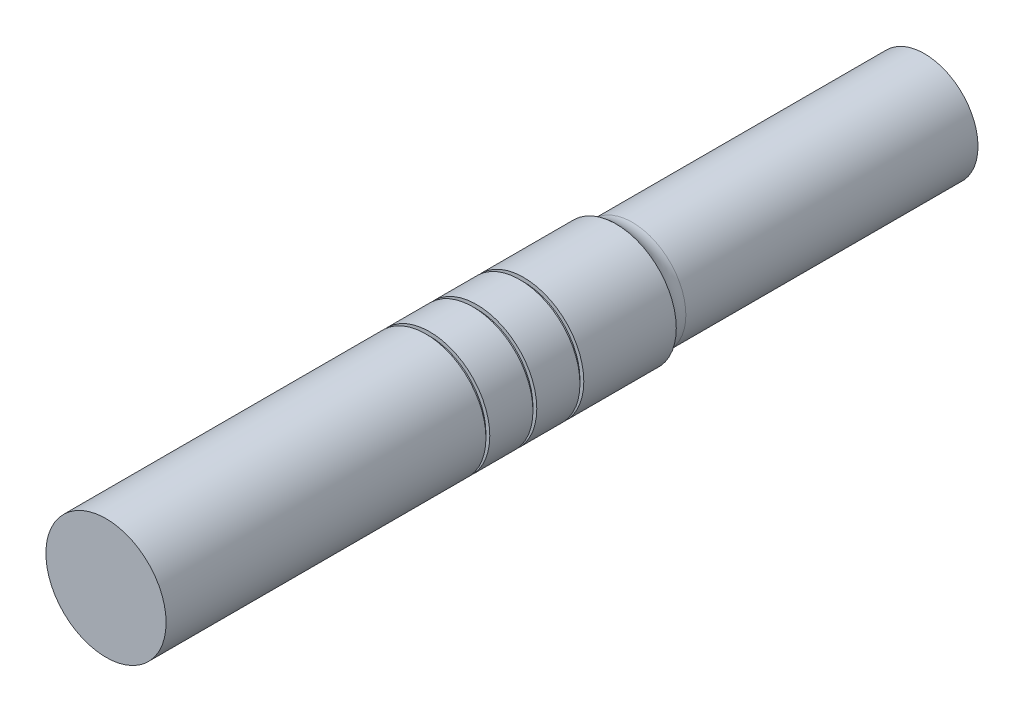
ISO-10303-21;
HEADER;
FILE_DESCRIPTION(('STEP AP214'),'2;1');
FILE_NAME('part.step','',(''),(''),'','','');
FILE_SCHEMA(('AUTOMOTIVE_DESIGN { 1 0 10303 214 1 1 1 1 }'));
ENDSEC;
DATA;
#1=APPLICATION_CONTEXT('core data for automotive mechanical design processes');
#2=APPLICATION_PROTOCOL_DEFINITION('international standard','automotive_design',2000,#1);
#3=PRODUCT_CONTEXT('',#1,'mechanical');
#4=PRODUCT('Part','Part','',(#3));
#5=PRODUCT_RELATED_PRODUCT_CATEGORY('part','',(#4));
#6=PRODUCT_DEFINITION_FORMATION('','',#4);
#7=PRODUCT_DEFINITION_CONTEXT('part definition',#1,'design');
#8=PRODUCT_DEFINITION('design','',#6,#7);
#9=PRODUCT_DEFINITION_SHAPE('','',#8);
#10=(LENGTH_UNIT() NAMED_UNIT(*) SI_UNIT(.MILLI.,.METRE.));
#11=(NAMED_UNIT(*) PLANE_ANGLE_UNIT() SI_UNIT($,.RADIAN.));
#12=(NAMED_UNIT(*) SI_UNIT($,.STERADIAN.) SOLID_ANGLE_UNIT());
#13=UNCERTAINTY_MEASURE_WITH_UNIT(LENGTH_MEASURE(1.E-05),#10,'distance_accuracy_value','');
#14=(GEOMETRIC_REPRESENTATION_CONTEXT(3) GLOBAL_UNCERTAINTY_ASSIGNED_CONTEXT((#13)) GLOBAL_UNIT_ASSIGNED_CONTEXT((#10,
#11,#12)) REPRESENTATION_CONTEXT('',''));
#15=CARTESIAN_POINT('',(0.,0.,0.));
#16=DIRECTION('',(0.,0.,1.));
#17=DIRECTION('',(1.,0.,0.));
#18=AXIS2_PLACEMENT_3D('',#15,#16,#17);
#19=CARTESIAN_POINT('',(0.,0.,127.));
#20=DIRECTION('',(0.,0.,1.));
#21=DIRECTION('',(1.,0.,0.));
#22=AXIS2_PLACEMENT_3D('',#19,#20,#21);
#23=CYLINDRICAL_SURFACE('',#22,1.8542);
#24=CARTESIAN_POINT('',(0.,0.,-0.152399999999997));
#25=DIRECTION('',(0.,0.,1.));
#26=DIRECTION('',(1.,0.,0.));
#27=AXIS2_PLACEMENT_3D('',#24,#25,#26);
#28=CIRCLE('',#27,1.8542);
#29=CARTESIAN_POINT('',(1.8542,0.,-0.152399999999997));
#30=VERTEX_POINT('',#29);
#31=EDGE_CURVE('E104',#30,#30,#28,.T.);
#32=ORIENTED_EDGE('',*,*,#31,.F.);
#33=EDGE_LOOP('',(#32));
#34=FACE_BOUND('',#33,.T.);
#35=CARTESIAN_POINT('',(0.,0.,-0.279400000000013));
#36=DIRECTION('',(0.,0.,1.));
#37=DIRECTION('',(1.,0.,0.));
#38=AXIS2_PLACEMENT_3D('',#35,#36,#37);
#39=CIRCLE('',#38,1.8542);
#40=CARTESIAN_POINT('',(1.8542,0.,-0.279400000000013));
#41=VERTEX_POINT('',#40);
#42=EDGE_CURVE('E60',#41,#41,#39,.T.);
#43=ORIENTED_EDGE('',*,*,#42,.T.);
#44=EDGE_LOOP('',(#43));
#45=FACE_BOUND('',#44,.T.);
#46=ADVANCED_FACE('F39',(#34,#45),#23,.T.);
#47=CARTESIAN_POINT('',(0.,1.9812,-0.15240000000001));
#48=DIRECTION('',(0.,0.,1.));
#49=DIRECTION('',(1.,0.,0.));
#50=AXIS2_PLACEMENT_3D('',#47,#48,#49);
#51=PLANE('',#50);
#52=CARTESIAN_POINT('',(0.,0.,-0.152399999999997));
#53=DIRECTION('',(0.,0.,1.));
#54=DIRECTION('',(1.,0.,0.));
#55=AXIS2_PLACEMENT_3D('',#52,#53,#54);
#56=CIRCLE('',#55,1.9812);
#57=CARTESIAN_POINT('',(1.9812,0.,-0.152399999999997));
#58=VERTEX_POINT('',#57);
#59=EDGE_CURVE('E101',#58,#58,#56,.T.);
#60=ORIENTED_EDGE('',*,*,#59,.F.);
#61=EDGE_LOOP('',(#60));
#62=FACE_BOUND('',#61,.T.);
#63=ORIENTED_EDGE('',*,*,#31,.T.);
#64=EDGE_LOOP('',(#63));
#65=FACE_BOUND('',#64,.T.);
#66=ADVANCED_FACE('F131',(#62,#65),#51,.F.);
#67=CARTESIAN_POINT('',(0.,0.,127.));
#68=DIRECTION('',(0.,0.,1.));
#69=DIRECTION('',(1.,0.,0.));
#70=AXIS2_PLACEMENT_3D('',#67,#68,#69);
#71=CYLINDRICAL_SURFACE('',#70,1.9812);
#72=CARTESIAN_POINT('',(0.,0.,1.26999999999999));
#73=DIRECTION('',(0.,0.,1.));
#74=DIRECTION('',(1.,0.,0.));
#75=AXIS2_PLACEMENT_3D('',#72,#73,#74);
#76=CIRCLE('',#75,1.9812);
#77=CARTESIAN_POINT('',(1.9812,0.,1.26999999999999));
#78=VERTEX_POINT('',#77);
#79=EDGE_CURVE('E98',#78,#78,#76,.T.);
#80=ORIENTED_EDGE('',*,*,#79,.F.);
#81=EDGE_LOOP('',(#80));
#82=FACE_BOUND('',#81,.T.);
#83=ORIENTED_EDGE('',*,*,#59,.T.);
#84=EDGE_LOOP('',(#83));
#85=FACE_BOUND('',#84,.T.);
#86=ADVANCED_FACE('F137',(#82,#85),#71,.T.);
#87=CARTESIAN_POINT('',(0.,1.9812,1.26999999999999));
#88=DIRECTION('',(0.,0.,-1.));
#89=DIRECTION('',(-1.,0.,0.));
#90=AXIS2_PLACEMENT_3D('',#87,#88,#89);
#91=PLANE('',#90);
#92=CARTESIAN_POINT('',(0.,0.,1.26999999999999));
#93=DIRECTION('',(0.,0.,1.));
#94=DIRECTION('',(1.,0.,0.));
#95=AXIS2_PLACEMENT_3D('',#92,#93,#94);
#96=CIRCLE('',#95,1.8542);
#97=CARTESIAN_POINT('',(1.8542,0.,1.26999999999999));
#98=VERTEX_POINT('',#97);
#99=EDGE_CURVE('E95',#98,#98,#96,.T.);
#100=ORIENTED_EDGE('',*,*,#99,.F.);
#101=EDGE_LOOP('',(#100));
#102=FACE_BOUND('',#101,.T.);
#103=ORIENTED_EDGE('',*,*,#79,.T.);
#104=EDGE_LOOP('',(#103));
#105=FACE_BOUND('',#104,.T.);
#106=ADVANCED_FACE('F145',(#102,#105),#91,.F.);
#107=CARTESIAN_POINT('',(0.,0.,127.));
#108=DIRECTION('',(0.,0.,1.));
#109=DIRECTION('',(1.,0.,0.));
#110=AXIS2_PLACEMENT_3D('',#107,#108,#109);
#111=CYLINDRICAL_SURFACE('',#110,1.8542);
#112=CARTESIAN_POINT('',(0.,0.,1.39699999999998));
#113=DIRECTION('',(0.,0.,1.));
#114=DIRECTION('',(1.,0.,0.));
#115=AXIS2_PLACEMENT_3D('',#112,#113,#114);
#116=CIRCLE('',#115,1.8542);
#117=CARTESIAN_POINT('',(1.8542,0.,1.39699999999998));
#118=VERTEX_POINT('',#117);
#119=EDGE_CURVE('E92',#118,#118,#116,.T.);
#120=ORIENTED_EDGE('',*,*,#119,.F.);
#121=EDGE_LOOP('',(#120));
#122=FACE_BOUND('',#121,.T.);
#123=ORIENTED_EDGE('',*,*,#99,.T.);
#124=EDGE_LOOP('',(#123));
#125=FACE_BOUND('',#124,.T.);
#126=ADVANCED_FACE('F149',(#122,#125),#111,.T.);
#127=CARTESIAN_POINT('',(0.,1.8542,1.39699999999999));
#128=DIRECTION('',(0.,0.,1.));
#129=DIRECTION('',(1.,0.,0.));
#130=AXIS2_PLACEMENT_3D('',#127,#128,#129);
#131=PLANE('',#130);
#132=CARTESIAN_POINT('',(0.,0.,1.39699999999998));
#133=DIRECTION('',(0.,0.,1.));
#134=DIRECTION('',(1.,0.,0.));
#135=AXIS2_PLACEMENT_3D('',#132,#133,#134);
#136=CIRCLE('',#135,1.9812);
#137=CARTESIAN_POINT('',(1.9812,0.,1.39699999999998));
#138=VERTEX_POINT('',#137);
#139=EDGE_CURVE('E89',#138,#138,#136,.T.);
#140=ORIENTED_EDGE('',*,*,#139,.F.);
#141=EDGE_LOOP('',(#140));
#142=FACE_BOUND('',#141,.T.);
#143=ORIENTED_EDGE('',*,*,#119,.T.);
#144=EDGE_LOOP('',(#143));
#145=FACE_BOUND('',#144,.T.);
#146=ADVANCED_FACE('F153',(#142,#145),#131,.F.);
#147=CARTESIAN_POINT('',(0.,0.,127.));
#148=DIRECTION('',(0.,0.,1.));
#149=DIRECTION('',(1.,0.,0.));
#150=AXIS2_PLACEMENT_3D('',#147,#148,#149);
#151=CYLINDRICAL_SURFACE('',#150,1.9812);
#152=CARTESIAN_POINT('',(0.,0.,2.81939999999999));
#153=DIRECTION('',(0.,0.,1.));
#154=DIRECTION('',(1.,0.,0.));
#155=AXIS2_PLACEMENT_3D('',#152,#153,#154);
#156=CIRCLE('',#155,1.9812);
#157=CARTESIAN_POINT('',(1.9812,0.,2.81939999999999));
#158=VERTEX_POINT('',#157);
#159=EDGE_CURVE('E86',#158,#158,#156,.T.);
#160=ORIENTED_EDGE('',*,*,#159,.F.);
#161=EDGE_LOOP('',(#160));
#162=FACE_BOUND('',#161,.T.);
#163=ORIENTED_EDGE('',*,*,#139,.T.);
#164=EDGE_LOOP('',(#163));
#165=FACE_BOUND('',#164,.T.);
#166=ADVANCED_FACE('F157',(#162,#165),#151,.T.);
#167=CARTESIAN_POINT('',(0.,1.9812,2.81939999999999));
#168=DIRECTION('',(0.,0.,-1.));
#169=DIRECTION('',(-1.,0.,0.));
#170=AXIS2_PLACEMENT_3D('',#167,#168,#169);
#171=PLANE('',#170);
#172=CARTESIAN_POINT('',(0.,0.,2.81939999999999));
#173=DIRECTION('',(0.,0.,1.));
#174=DIRECTION('',(1.,0.,0.));
#175=AXIS2_PLACEMENT_3D('',#172,#173,#174);
#176=CIRCLE('',#175,1.8542);
#177=CARTESIAN_POINT('',(1.8542,0.,2.81939999999999));
#178=VERTEX_POINT('',#177);
#179=EDGE_CURVE('E83',#178,#178,#176,.T.);
#180=ORIENTED_EDGE('',*,*,#179,.F.);
#181=EDGE_LOOP('',(#180));
#182=FACE_BOUND('',#181,.T.);
#183=ORIENTED_EDGE('',*,*,#159,.T.);
#184=EDGE_LOOP('',(#183));
#185=FACE_BOUND('',#184,.T.);
#186=ADVANCED_FACE('F161',(#182,#185),#171,.F.);
#187=CARTESIAN_POINT('',(0.,0.,127.));
#188=DIRECTION('',(0.,0.,1.));
#189=DIRECTION('',(1.,0.,0.));
#190=AXIS2_PLACEMENT_3D('',#187,#188,#189);
#191=CYLINDRICAL_SURFACE('',#190,1.8542);
#192=CARTESIAN_POINT('',(0.,0.,2.94639999999999));
#193=DIRECTION('',(0.,0.,1.));
#194=DIRECTION('',(1.,0.,0.));
#195=AXIS2_PLACEMENT_3D('',#192,#193,#194);
#196=CIRCLE('',#195,1.8542);
#197=CARTESIAN_POINT('',(1.8542,0.,2.94639999999999));
#198=VERTEX_POINT('',#197);
#199=EDGE_CURVE('E80',#198,#198,#196,.T.);
#200=ORIENTED_EDGE('',*,*,#199,.F.);
#201=EDGE_LOOP('',(#200));
#202=FACE_BOUND('',#201,.T.);
#203=ORIENTED_EDGE('',*,*,#179,.T.);
#204=EDGE_LOOP('',(#203));
#205=FACE_BOUND('',#204,.T.);
#206=ADVANCED_FACE('F165',(#202,#205),#191,.T.);
#207=CARTESIAN_POINT('',(0.,1.8542,2.94639999999999));
#208=DIRECTION('',(0.,0.,1.));
#209=DIRECTION('',(1.,0.,0.));
#210=AXIS2_PLACEMENT_3D('',#207,#208,#209);
#211=PLANE('',#210);
#212=CARTESIAN_POINT('',(0.,0.,2.94639999999999));
#213=DIRECTION('',(0.,0.,1.));
#214=DIRECTION('',(1.,0.,0.));
#215=AXIS2_PLACEMENT_3D('',#212,#213,#214);
#216=CIRCLE('',#215,1.9812);
#217=CARTESIAN_POINT('',(1.9812,0.,2.94639999999999));
#218=VERTEX_POINT('',#217);
#219=EDGE_CURVE('E77',#218,#218,#216,.T.);
#220=ORIENTED_EDGE('',*,*,#219,.F.);
#221=EDGE_LOOP('',(#220));
#222=FACE_BOUND('',#221,.T.);
#223=ORIENTED_EDGE('',*,*,#199,.T.);
#224=EDGE_LOOP('',(#223));
#225=FACE_BOUND('',#224,.T.);
#226=ADVANCED_FACE('F169',(#222,#225),#211,.F.);
#227=CARTESIAN_POINT('',(0.,0.,127.));
#228=DIRECTION('',(0.,0.,1.));
#229=DIRECTION('',(1.,0.,0.));
#230=AXIS2_PLACEMENT_3D('',#227,#228,#229);
#231=CYLINDRICAL_SURFACE('',#230,1.9812);
#232=CARTESIAN_POINT('',(0.,0.,13.4874));
#233=DIRECTION('',(0.,0.,1.));
#234=DIRECTION('',(1.,0.,0.));
#235=AXIS2_PLACEMENT_3D('',#232,#233,#234);
#236=CIRCLE('',#235,1.9812);
#237=CARTESIAN_POINT('',(1.9812,0.,13.4874));
#238=VERTEX_POINT('',#237);
#239=EDGE_CURVE('E74',#238,#238,#236,.T.);
#240=ORIENTED_EDGE('',*,*,#239,.F.);
#241=EDGE_LOOP('',(#240));
#242=FACE_BOUND('',#241,.T.);
#243=ORIENTED_EDGE('',*,*,#219,.T.);
#244=EDGE_LOOP('',(#243));
#245=FACE_BOUND('',#244,.T.);
#246=ADVANCED_FACE('F173',(#242,#245),#231,.T.);
#247=CARTESIAN_POINT('',(0.,0.,13.4874));
#248=DIRECTION('',(0.,0.,-1.));
#249=DIRECTION('',(-1.,0.,0.));
#250=AXIS2_PLACEMENT_3D('',#247,#248,#249);
#251=PLANE('',#250);
#252=ORIENTED_EDGE('',*,*,#239,.T.);
#253=EDGE_LOOP('',(#252));
#254=FACE_BOUND('',#253,.T.);
#255=ADVANCED_FACE('F127',(#254),#251,.F.);
#256=CARTESIAN_POINT('',(0.,0.,127.));
#257=DIRECTION('',(0.,0.,1.));
#258=DIRECTION('',(1.,0.,0.));
#259=AXIS2_PLACEMENT_3D('',#256,#257,#258);
#260=CYLINDRICAL_SURFACE('',#259,1.7653);
#261=CARTESIAN_POINT('',(0.,0.,-3.85883088920386));
#262=DIRECTION('',(0.,0.,1.));
#263=DIRECTION('',(1.,0.,0.));
#264=AXIS2_PLACEMENT_3D('',#261,#262,#263);
#265=CIRCLE('',#264,1.7653);
#266=CARTESIAN_POINT('',(1.7653,0.,-3.85883088920386));
#267=VERTEX_POINT('',#266);
#268=EDGE_CURVE('E47',#267,#267,#265,.F.);
#269=ORIENTED_EDGE('',*,*,#268,.T.);
#270=EDGE_LOOP('',(#269));
#271=FACE_BOUND('',#270,.T.);
#272=CARTESIAN_POINT('',(0.,0.,-13.4874));
#273=DIRECTION('',(0.,0.,1.));
#274=DIRECTION('',(1.,0.,0.));
#275=AXIS2_PLACEMENT_3D('',#272,#273,#274);
#276=CIRCLE('',#275,1.7653);
#277=CARTESIAN_POINT('',(1.7653,0.,-13.4874));
#278=VERTEX_POINT('',#277);
#279=EDGE_CURVE('E71',#278,#278,#276,.T.);
#280=ORIENTED_EDGE('',*,*,#279,.T.);
#281=EDGE_LOOP('',(#280));
#282=FACE_BOUND('',#281,.T.);
#283=ADVANCED_FACE('F109',(#271,#282),#260,.T.);
#284=CARTESIAN_POINT('',(0.,0.,127.));
#285=DIRECTION('',(0.,0.,1.));
#286=DIRECTION('',(1.,0.,0.));
#287=AXIS2_PLACEMENT_3D('',#284,#285,#286);
#288=CYLINDRICAL_SURFACE('',#287,1.9812);
#289=CARTESIAN_POINT('',(0.,0.,-0.279400000000013));
#290=DIRECTION('',(0.,0.,1.));
#291=DIRECTION('',(1.,0.,0.));
#292=AXIS2_PLACEMENT_3D('',#289,#290,#291);
#293=CIRCLE('',#292,1.9812);
#294=CARTESIAN_POINT('',(1.9812,0.,-0.279400000000013));
#295=VERTEX_POINT('',#294);
#296=EDGE_CURVE('E63',#295,#295,#293,.T.);
#297=ORIENTED_EDGE('',*,*,#296,.F.);
#298=EDGE_LOOP('',(#297));
#299=FACE_BOUND('',#298,.T.);
#300=CARTESIAN_POINT('',(0.,0.,-3.32740000000001));
#301=DIRECTION('',(0.,0.,1.));
#302=DIRECTION('',(1.,0.,0.));
#303=AXIS2_PLACEMENT_3D('',#300,#301,#302);
#304=CIRCLE('',#303,1.9812);
#305=CARTESIAN_POINT('',(1.9812,0.,-3.32740000000001));
#306=VERTEX_POINT('',#305);
#307=EDGE_CURVE('E68',#306,#306,#304,.T.);
#308=ORIENTED_EDGE('',*,*,#307,.T.);
#309=EDGE_LOOP('',(#308));
#310=FACE_BOUND('',#309,.T.);
#311=ADVANCED_FACE('F117',(#299,#310),#288,.T.);
#312=CARTESIAN_POINT('',(0.,1.8542,-0.27940000000001));
#313=DIRECTION('',(0.,0.,-1.));
#314=DIRECTION('',(-1.,0.,0.));
#315=AXIS2_PLACEMENT_3D('',#312,#313,#314);
#316=PLANE('',#315);
#317=ORIENTED_EDGE('',*,*,#42,.F.);
#318=EDGE_LOOP('',(#317));
#319=FACE_BOUND('',#318,.T.);
#320=ORIENTED_EDGE('',*,*,#296,.T.);
#321=EDGE_LOOP('',(#320));
#322=FACE_BOUND('',#321,.T.);
#323=ADVANCED_FACE('F114',(#319,#322),#316,.F.);
#324=CARTESIAN_POINT('',(0.,0.,-3.85883088920386));
#325=DIRECTION('',(0.,0.,1.));
#326=DIRECTION('',(1.,0.,0.));
#327=AXIS2_PLACEMENT_3D('',#324,#325,#326);
#328=TOROIDAL_SURFACE('',#327,2.5273,0.762);
#329=ORIENTED_EDGE('',*,*,#268,.F.);
#330=EDGE_LOOP('',(#329));
#331=FACE_BOUND('',#330,.T.);
#332=ORIENTED_EDGE('',*,*,#307,.F.);
#333=EDGE_LOOP('',(#332));
#334=FACE_BOUND('',#333,.T.);
#335=ADVANCED_FACE('F54',(#331,#334),#328,.F.);
#336=CARTESIAN_POINT('',(0.,0.,-12.6238));
#337=DIRECTION('',(0.,0.,-1.));
#338=DIRECTION('',(-1.,0.,0.));
#339=AXIS2_PLACEMENT_3D('',#336,#337,#338);
#340=CONICAL_SURFACE('',#339,1.1811,1.02974425867665);
#341=CARTESIAN_POINT('',(0.,0.,-11.9141235228666));
#342=VERTEX_POINT('',#341);
#343=VERTEX_LOOP('',#342);
#344=FACE_BOUND('',#343,.T.);
#345=CARTESIAN_POINT('',(0.,0.,-12.6238));
#346=DIRECTION('',(0.,0.,-1.));
#347=DIRECTION('',(-1.,0.,0.));
#348=AXIS2_PLACEMENT_3D('',#345,#346,#347);
#349=CIRCLE('',#348,1.1811);
#350=CARTESIAN_POINT('',(-1.1811,0.,-12.6238));
#351=VERTEX_POINT('',#350);
#352=EDGE_CURVE('E58',#351,#351,#349,.T.);
#353=ORIENTED_EDGE('',*,*,#352,.T.);
#354=EDGE_LOOP('',(#353));
#355=FACE_BOUND('',#354,.T.);
#356=ADVANCED_FACE('F50',(#344,#355),#340,.F.);
#357=CARTESIAN_POINT('',(0.,0.,-13.4874));
#358=DIRECTION('',(0.,0.,-1.));
#359=DIRECTION('',(-1.,0.,0.));
#360=AXIS2_PLACEMENT_3D('',#357,#358,#359);
#361=CYLINDRICAL_SURFACE('',#360,1.1811);
#362=CARTESIAN_POINT('',(0.,0.,-13.1501119727394));
#363=DIRECTION('',(0.,0.,1.));
#364=DIRECTION('',(1.,0.,0.));
#365=AXIS2_PLACEMENT_3D('',#362,#363,#364);
#366=CIRCLE('',#365,1.1811);
#367=CARTESIAN_POINT('',(1.1811,0.,-13.1501119727394));
#368=VERTEX_POINT('',#367);
#369=EDGE_CURVE('E11',#368,#368,#366,.F.);
#370=ORIENTED_EDGE('',*,*,#369,.T.);
#371=EDGE_LOOP('',(#370));
#372=FACE_BOUND('',#371,.T.);
#373=ORIENTED_EDGE('',*,*,#352,.F.);
#374=EDGE_LOOP('',(#373));
#375=FACE_BOUND('',#374,.T.);
#376=ADVANCED_FACE('F53',(#372,#375),#361,.F.);
#377=CARTESIAN_POINT('',(0.,0.,-13.1501119727394));
#378=DIRECTION('',(0.,0.,-1.));
#379=DIRECTION('',(-1.,0.,0.));
#380=AXIS2_PLACEMENT_3D('',#377,#378,#379);
#381=CONICAL_SURFACE('',#380,1.1811,1.0471975511966);
#382=ORIENTED_EDGE('',*,*,#279,.F.);
#383=EDGE_LOOP('',(#382));
#384=FACE_BOUND('',#383,.T.);
#385=ORIENTED_EDGE('',*,*,#369,.F.);
#386=EDGE_LOOP('',(#385));
#387=FACE_BOUND('',#386,.T.);
#388=ADVANCED_FACE('F42',(#384,#387),#381,.F.);
#389=CLOSED_SHELL('',(#46,#66,#86,#106,#126,#146,#166,#186,#206,#226,#246,#255,#283,#311,#323,
#335,#356,#376,#388));
#390=MANIFOLD_SOLID_BREP('B2',#389);
#391=ADVANCED_BREP_SHAPE_REPRESENTATION('',(#18,#390),#14);
#392=SHAPE_DEFINITION_REPRESENTATION(#9,#391);
ENDSEC;
END-ISO-10303-21;
